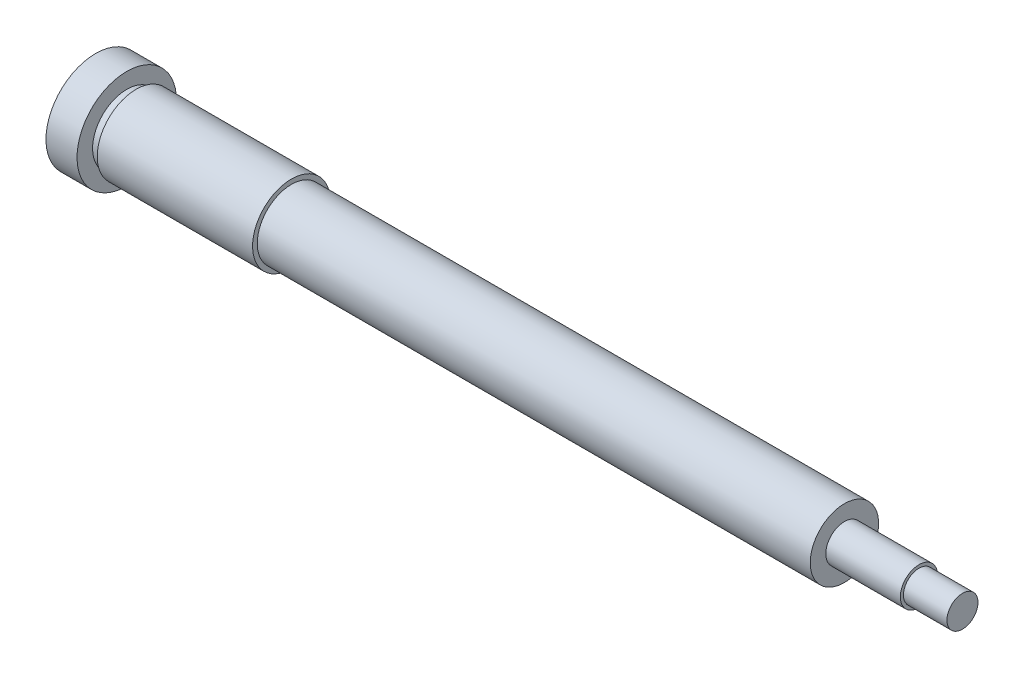
ISO-10303-21;
HEADER;
FILE_DESCRIPTION(('STEP AP214'),'2;1');
FILE_NAME('part.step','',(''),(''),'','','');
FILE_SCHEMA(('AUTOMOTIVE_DESIGN { 1 0 10303 214 1 1 1 1 }'));
ENDSEC;
DATA;
#1=APPLICATION_CONTEXT('core data for automotive mechanical design processes');
#2=APPLICATION_PROTOCOL_DEFINITION('international standard','automotive_design',2000,#1);
#3=PRODUCT_CONTEXT('',#1,'mechanical');
#4=PRODUCT('Part','Part','',(#3));
#5=PRODUCT_RELATED_PRODUCT_CATEGORY('part','',(#4));
#6=PRODUCT_DEFINITION_FORMATION('','',#4);
#7=PRODUCT_DEFINITION_CONTEXT('part definition',#1,'design');
#8=PRODUCT_DEFINITION('design','',#6,#7);
#9=PRODUCT_DEFINITION_SHAPE('','',#8);
#10=(LENGTH_UNIT() NAMED_UNIT(*) SI_UNIT(.MILLI.,.METRE.));
#11=(NAMED_UNIT(*) PLANE_ANGLE_UNIT() SI_UNIT($,.RADIAN.));
#12=(NAMED_UNIT(*) SI_UNIT($,.STERADIAN.) SOLID_ANGLE_UNIT());
#13=UNCERTAINTY_MEASURE_WITH_UNIT(LENGTH_MEASURE(1.E-05),#10,'distance_accuracy_value','');
#14=(GEOMETRIC_REPRESENTATION_CONTEXT(3) GLOBAL_UNCERTAINTY_ASSIGNED_CONTEXT((#13)) GLOBAL_UNIT_ASSIGNED_CONTEXT((#10,
#11,#12)) REPRESENTATION_CONTEXT('',''));
#15=CARTESIAN_POINT('',(0.,0.,0.));
#16=DIRECTION('',(0.,0.,1.));
#17=DIRECTION('',(1.,0.,0.));
#18=AXIS2_PLACEMENT_3D('',#15,#16,#17);
#19=CARTESIAN_POINT('',(0.,0.,0.));
#20=DIRECTION('',(-1.,0.,0.));
#21=DIRECTION('',(0.,-1.,0.));
#22=AXIS2_PLACEMENT_3D('',#19,#20,#21);
#23=PLANE('',#22);
#24=CARTESIAN_POINT('',(0.,0.,0.));
#25=DIRECTION('',(1.,0.,0.));
#26=DIRECTION('',(0.,1.,0.));
#27=AXIS2_PLACEMENT_3D('',#24,#25,#26);
#28=CIRCLE('',#27,16.);
#29=CARTESIAN_POINT('',(0.,16.,0.));
#30=VERTEX_POINT('',#29);
#31=EDGE_CURVE('E10',#30,#30,#28,.T.);
#32=ORIENTED_EDGE('',*,*,#31,.F.);
#33=EDGE_LOOP('',(#32));
#34=FACE_BOUND('',#33,.T.);
#35=ADVANCED_FACE('F43',(#34),#23,.T.);
#36=CARTESIAN_POINT('',(279.,0.,0.));
#37=DIRECTION('',(1.,0.,0.));
#38=DIRECTION('',(0.,1.,0.));
#39=AXIS2_PLACEMENT_3D('',#36,#37,#38);
#40=CYLINDRICAL_SURFACE('',#39,16.);
#41=ORIENTED_EDGE('',*,*,#31,.T.);
#42=EDGE_LOOP('',(#41));
#43=FACE_BOUND('',#42,.T.);
#44=CARTESIAN_POINT('',(10.,0.,0.));
#45=DIRECTION('',(1.,0.,0.));
#46=DIRECTION('',(0.,1.,0.));
#47=AXIS2_PLACEMENT_3D('',#44,#45,#46);
#48=CIRCLE('',#47,16.);
#49=CARTESIAN_POINT('',(10.,16.,0.));
#50=VERTEX_POINT('',#49);
#51=EDGE_CURVE('E50',#50,#50,#48,.T.);
#52=ORIENTED_EDGE('',*,*,#51,.F.);
#53=EDGE_LOOP('',(#52));
#54=FACE_BOUND('',#53,.T.);
#55=ADVANCED_FACE('F115',(#43,#54),#40,.T.);
#56=CARTESIAN_POINT('',(10.,16.,0.));
#57=DIRECTION('',(1.,0.,0.));
#58=DIRECTION('',(0.,1.,0.));
#59=AXIS2_PLACEMENT_3D('',#56,#57,#58);
#60=PLANE('',#59);
#61=ORIENTED_EDGE('',*,*,#51,.T.);
#62=EDGE_LOOP('',(#61));
#63=FACE_BOUND('',#62,.T.);
#64=CARTESIAN_POINT('',(10.,0.,0.));
#65=DIRECTION('',(1.,0.,0.));
#66=DIRECTION('',(0.,1.,0.));
#67=AXIS2_PLACEMENT_3D('',#64,#65,#66);
#68=CIRCLE('',#67,11.);
#69=CARTESIAN_POINT('',(10.,11.,0.));
#70=VERTEX_POINT('',#69);
#71=EDGE_CURVE('E55',#70,#70,#68,.T.);
#72=ORIENTED_EDGE('',*,*,#71,.F.);
#73=EDGE_LOOP('',(#72));
#74=FACE_BOUND('',#73,.T.);
#75=ADVANCED_FACE('F120',(#63,#74),#60,.T.);
#76=CARTESIAN_POINT('',(279.,0.,0.));
#77=DIRECTION('',(1.,0.,0.));
#78=DIRECTION('',(0.,1.,0.));
#79=AXIS2_PLACEMENT_3D('',#76,#77,#78);
#80=CYLINDRICAL_SURFACE('',#79,11.);
#81=ORIENTED_EDGE('',*,*,#71,.T.);
#82=EDGE_LOOP('',(#81));
#83=FACE_BOUND('',#82,.T.);
#84=CARTESIAN_POINT('',(13.,0.,0.));
#85=DIRECTION('',(1.,0.,0.));
#86=DIRECTION('',(0.,1.,0.));
#87=AXIS2_PLACEMENT_3D('',#84,#85,#86);
#88=CIRCLE('',#87,11.);
#89=CARTESIAN_POINT('',(13.,11.,0.));
#90=VERTEX_POINT('',#89);
#91=EDGE_CURVE('E60',#90,#90,#88,.T.);
#92=ORIENTED_EDGE('',*,*,#91,.F.);
#93=EDGE_LOOP('',(#92));
#94=FACE_BOUND('',#93,.T.);
#95=ADVANCED_FACE('F124',(#83,#94),#80,.T.);
#96=CARTESIAN_POINT('',(13.,11.,0.));
#97=DIRECTION('',(-1.,0.,0.));
#98=DIRECTION('',(0.,-1.,0.));
#99=AXIS2_PLACEMENT_3D('',#96,#97,#98);
#100=PLANE('',#99);
#101=ORIENTED_EDGE('',*,*,#91,.T.);
#102=EDGE_LOOP('',(#101));
#103=FACE_BOUND('',#102,.T.);
#104=CARTESIAN_POINT('',(13.,0.,0.));
#105=DIRECTION('',(1.,0.,0.));
#106=DIRECTION('',(0.,1.,0.));
#107=AXIS2_PLACEMENT_3D('',#104,#105,#106);
#108=CIRCLE('',#107,12.5);
#109=CARTESIAN_POINT('',(13.,12.5,0.));
#110=VERTEX_POINT('',#109);
#111=EDGE_CURVE('E66',#110,#110,#108,.T.);
#112=ORIENTED_EDGE('',*,*,#111,.F.);
#113=EDGE_LOOP('',(#112));
#114=FACE_BOUND('',#113,.T.);
#115=ADVANCED_FACE('F130',(#103,#114),#100,.T.);
#116=CARTESIAN_POINT('',(279.,0.,0.));
#117=DIRECTION('',(1.,0.,0.));
#118=DIRECTION('',(0.,1.,0.));
#119=AXIS2_PLACEMENT_3D('',#116,#117,#118);
#120=CYLINDRICAL_SURFACE('',#119,12.5);
#121=ORIENTED_EDGE('',*,*,#111,.T.);
#122=EDGE_LOOP('',(#121));
#123=FACE_BOUND('',#122,.T.);
#124=CARTESIAN_POINT('',(63.,0.,0.));
#125=DIRECTION('',(1.,0.,0.));
#126=DIRECTION('',(0.,1.,0.));
#127=AXIS2_PLACEMENT_3D('',#124,#125,#126);
#128=CIRCLE('',#127,12.5);
#129=CARTESIAN_POINT('',(63.,12.5,0.));
#130=VERTEX_POINT('',#129);
#131=EDGE_CURVE('E70',#130,#130,#128,.T.);
#132=ORIENTED_EDGE('',*,*,#131,.F.);
#133=EDGE_LOOP('',(#132));
#134=FACE_BOUND('',#133,.T.);
#135=ADVANCED_FACE('F134',(#123,#134),#120,.T.);
#136=CARTESIAN_POINT('',(63.,12.5,0.));
#137=DIRECTION('',(1.,0.,0.));
#138=DIRECTION('',(0.,1.,0.));
#139=AXIS2_PLACEMENT_3D('',#136,#137,#138);
#140=PLANE('',#139);
#141=ORIENTED_EDGE('',*,*,#131,.T.);
#142=EDGE_LOOP('',(#141));
#143=FACE_BOUND('',#142,.T.);
#144=CARTESIAN_POINT('',(63.,0.,0.));
#145=DIRECTION('',(1.,0.,0.));
#146=DIRECTION('',(0.,1.,0.));
#147=AXIS2_PLACEMENT_3D('',#144,#145,#146);
#148=CIRCLE('',#147,11.);
#149=CARTESIAN_POINT('',(63.,11.,0.));
#150=VERTEX_POINT('',#149);
#151=EDGE_CURVE('E74',#150,#150,#148,.T.);
#152=ORIENTED_EDGE('',*,*,#151,.F.);
#153=EDGE_LOOP('',(#152));
#154=FACE_BOUND('',#153,.T.);
#155=ADVANCED_FACE('F138',(#143,#154),#140,.T.);
#156=CARTESIAN_POINT('',(279.,0.,0.));
#157=DIRECTION('',(1.,0.,0.));
#158=DIRECTION('',(0.,1.,0.));
#159=AXIS2_PLACEMENT_3D('',#156,#157,#158);
#160=CYLINDRICAL_SURFACE('',#159,11.);
#161=ORIENTED_EDGE('',*,*,#151,.T.);
#162=EDGE_LOOP('',(#161));
#163=FACE_BOUND('',#162,.T.);
#164=CARTESIAN_POINT('',(241.,0.,0.));
#165=DIRECTION('',(1.,0.,0.));
#166=DIRECTION('',(0.,1.,0.));
#167=AXIS2_PLACEMENT_3D('',#164,#165,#166);
#168=CIRCLE('',#167,11.);
#169=CARTESIAN_POINT('',(241.,11.,0.));
#170=VERTEX_POINT('',#169);
#171=EDGE_CURVE('E78',#170,#170,#168,.T.);
#172=ORIENTED_EDGE('',*,*,#171,.F.);
#173=EDGE_LOOP('',(#172));
#174=FACE_BOUND('',#173,.T.);
#175=ADVANCED_FACE('F142',(#163,#174),#160,.T.);
#176=CARTESIAN_POINT('',(241.,11.,0.));
#177=DIRECTION('',(1.,0.,0.));
#178=DIRECTION('',(0.,1.,0.));
#179=AXIS2_PLACEMENT_3D('',#176,#177,#178);
#180=PLANE('',#179);
#181=ORIENTED_EDGE('',*,*,#171,.T.);
#182=EDGE_LOOP('',(#181));
#183=FACE_BOUND('',#182,.T.);
#184=CARTESIAN_POINT('',(241.,0.,0.));
#185=DIRECTION('',(1.,0.,0.));
#186=DIRECTION('',(0.,1.,0.));
#187=AXIS2_PLACEMENT_3D('',#184,#185,#186);
#188=CIRCLE('',#187,5.99999999999999);
#189=CARTESIAN_POINT('',(241.,5.99999999999999,0.));
#190=VERTEX_POINT('',#189);
#191=EDGE_CURVE('E82',#190,#190,#188,.T.);
#192=ORIENTED_EDGE('',*,*,#191,.F.);
#193=EDGE_LOOP('',(#192));
#194=FACE_BOUND('',#193,.T.);
#195=ADVANCED_FACE('F146',(#183,#194),#180,.T.);
#196=CARTESIAN_POINT('',(279.,0.,0.));
#197=DIRECTION('',(1.,0.,0.));
#198=DIRECTION('',(0.,1.,0.));
#199=AXIS2_PLACEMENT_3D('',#196,#197,#198);
#200=CYLINDRICAL_SURFACE('',#199,5.99999999999999);
#201=ORIENTED_EDGE('',*,*,#191,.T.);
#202=EDGE_LOOP('',(#201));
#203=FACE_BOUND('',#202,.T.);
#204=CARTESIAN_POINT('',(265.,0.,0.));
#205=DIRECTION('',(1.,0.,0.));
#206=DIRECTION('',(0.,1.,0.));
#207=AXIS2_PLACEMENT_3D('',#204,#205,#206);
#208=CIRCLE('',#207,5.99999999999999);
#209=CARTESIAN_POINT('',(265.,5.99999999999999,0.));
#210=VERTEX_POINT('',#209);
#211=EDGE_CURVE('E86',#210,#210,#208,.T.);
#212=ORIENTED_EDGE('',*,*,#211,.F.);
#213=EDGE_LOOP('',(#212));
#214=FACE_BOUND('',#213,.T.);
#215=ADVANCED_FACE('F111',(#203,#214),#200,.T.);
#216=CARTESIAN_POINT('',(265.,6.,0.));
#217=DIRECTION('',(1.,0.,0.));
#218=DIRECTION('',(0.,1.,0.));
#219=AXIS2_PLACEMENT_3D('',#216,#217,#218);
#220=PLANE('',#219);
#221=ORIENTED_EDGE('',*,*,#211,.T.);
#222=EDGE_LOOP('',(#221));
#223=FACE_BOUND('',#222,.T.);
#224=CARTESIAN_POINT('',(265.,0.,0.));
#225=DIRECTION('',(1.,0.,0.));
#226=DIRECTION('',(0.,1.,0.));
#227=AXIS2_PLACEMENT_3D('',#224,#225,#226);
#228=CIRCLE('',#227,5.);
#229=CARTESIAN_POINT('',(265.,5.00000000000001,0.));
#230=VERTEX_POINT('',#229);
#231=EDGE_CURVE('E90',#230,#230,#228,.T.);
#232=ORIENTED_EDGE('',*,*,#231,.F.);
#233=EDGE_LOOP('',(#232));
#234=FACE_BOUND('',#233,.T.);
#235=ADVANCED_FACE('F103',(#223,#234),#220,.T.);
#236=CARTESIAN_POINT('',(279.,0.,0.));
#237=DIRECTION('',(1.,0.,0.));
#238=DIRECTION('',(0.,1.,0.));
#239=AXIS2_PLACEMENT_3D('',#236,#237,#238);
#240=CYLINDRICAL_SURFACE('',#239,5.);
#241=ORIENTED_EDGE('',*,*,#231,.T.);
#242=EDGE_LOOP('',(#241));
#243=FACE_BOUND('',#242,.T.);
#244=CARTESIAN_POINT('',(279.,0.,0.));
#245=DIRECTION('',(1.,0.,0.));
#246=DIRECTION('',(0.,1.,0.));
#247=AXIS2_PLACEMENT_3D('',#244,#245,#246);
#248=CIRCLE('',#247,5.);
#249=CARTESIAN_POINT('',(279.,5.00000000000001,0.));
#250=VERTEX_POINT('',#249);
#251=EDGE_CURVE('E94',#250,#250,#248,.T.);
#252=ORIENTED_EDGE('',*,*,#251,.F.);
#253=EDGE_LOOP('',(#252));
#254=FACE_BOUND('',#253,.T.);
#255=ADVANCED_FACE('F101',(#243,#254),#240,.T.);
#256=CARTESIAN_POINT('',(279.,5.00000000000001,0.));
#257=DIRECTION('',(1.,0.,0.));
#258=DIRECTION('',(0.,1.,0.));
#259=AXIS2_PLACEMENT_3D('',#256,#257,#258);
#260=PLANE('',#259);
#261=ORIENTED_EDGE('',*,*,#251,.T.);
#262=EDGE_LOOP('',(#261));
#263=FACE_BOUND('',#262,.T.);
#264=ADVANCED_FACE('F99',(#263),#260,.T.);
#265=CLOSED_SHELL('',(#35,#55,#75,#95,#115,#135,#155,#175,#195,#215,#235,#255,#264));
#266=MANIFOLD_SOLID_BREP('B2',#265);
#267=ADVANCED_BREP_SHAPE_REPRESENTATION('',(#18,#266),#14);
#268=SHAPE_DEFINITION_REPRESENTATION(#9,#267);
ENDSEC;
END-ISO-10303-21;
